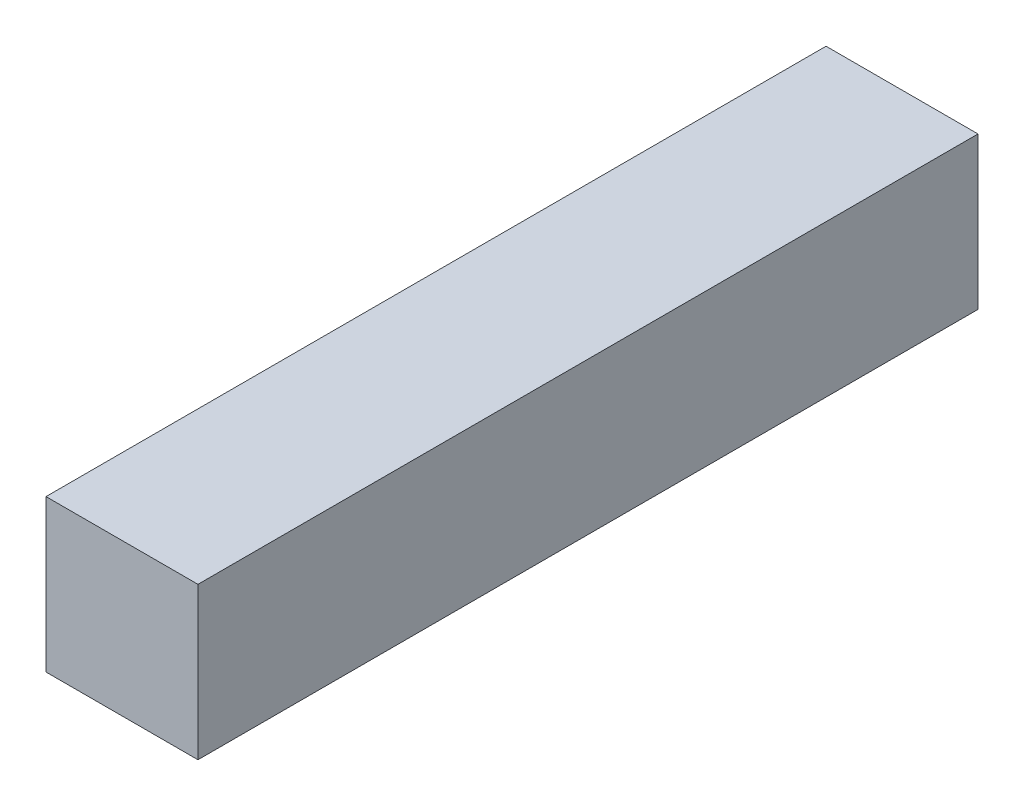
ISO-10303-21;
HEADER;
FILE_DESCRIPTION(('STEP AP214'),'2;1');
FILE_NAME('part.step','',(''),(''),'','','');
FILE_SCHEMA(('AUTOMOTIVE_DESIGN { 1 0 10303 214 1 1 1 1 }'));
ENDSEC;
DATA;
#1=APPLICATION_CONTEXT('core data for automotive mechanical design processes');
#2=APPLICATION_PROTOCOL_DEFINITION('international standard','automotive_design',2000,#1);
#3=PRODUCT_CONTEXT('',#1,'mechanical');
#4=PRODUCT('Part','Part','',(#3));
#5=PRODUCT_RELATED_PRODUCT_CATEGORY('part','',(#4));
#6=PRODUCT_DEFINITION_FORMATION('','',#4);
#7=PRODUCT_DEFINITION_CONTEXT('part definition',#1,'design');
#8=PRODUCT_DEFINITION('design','',#6,#7);
#9=PRODUCT_DEFINITION_SHAPE('','',#8);
#10=(LENGTH_UNIT() NAMED_UNIT(*) SI_UNIT(.MILLI.,.METRE.));
#11=(NAMED_UNIT(*) PLANE_ANGLE_UNIT() SI_UNIT($,.RADIAN.));
#12=(NAMED_UNIT(*) SI_UNIT($,.STERADIAN.) SOLID_ANGLE_UNIT());
#13=UNCERTAINTY_MEASURE_WITH_UNIT(LENGTH_MEASURE(1.E-05),#10,'distance_accuracy_value','');
#14=(GEOMETRIC_REPRESENTATION_CONTEXT(3) GLOBAL_UNCERTAINTY_ASSIGNED_CONTEXT((#13)) GLOBAL_UNIT_ASSIGNED_CONTEXT((#10,
#11,#12)) REPRESENTATION_CONTEXT('',''));
#15=CARTESIAN_POINT('',(0.,0.,0.));
#16=DIRECTION('',(0.,0.,1.));
#17=DIRECTION('',(1.,0.,0.));
#18=AXIS2_PLACEMENT_3D('',#15,#16,#17);
#19=CARTESIAN_POINT('',(7.5,7.5,77.));
#20=DIRECTION('',(-1.,0.,0.));
#21=DIRECTION('',(0.,-1.,0.));
#22=AXIS2_PLACEMENT_3D('',#19,#20,#21);
#23=PLANE('',#22);
#24=DIRECTION('',(0.,1.,0.));
#25=VECTOR('',#24,1.);
#26=CARTESIAN_POINT('',(7.5,7.5,0.));
#27=LINE('',#26,#25);
#28=CARTESIAN_POINT('',(7.5,-7.5,0.));
#29=VERTEX_POINT('',#28);
#30=CARTESIAN_POINT('',(7.5,7.5,0.));
#31=VERTEX_POINT('',#30);
#32=EDGE_CURVE('E101',#29,#31,#27,.T.);
#33=ORIENTED_EDGE('',*,*,#32,.T.);
#34=DIRECTION('',(0.,0.,-1.));
#35=VECTOR('',#34,1.);
#36=CARTESIAN_POINT('',(7.5,7.5,77.));
#37=LINE('',#36,#35);
#38=CARTESIAN_POINT('',(7.5,7.5,77.));
#39=VERTEX_POINT('',#38);
#40=EDGE_CURVE('E11',#39,#31,#37,.T.);
#41=ORIENTED_EDGE('',*,*,#40,.F.);
#42=DIRECTION('',(0.,1.,0.));
#43=VECTOR('',#42,1.);
#44=CARTESIAN_POINT('',(7.5,7.5,77.));
#45=LINE('',#44,#43);
#46=CARTESIAN_POINT('',(7.5,-7.5,77.));
#47=VERTEX_POINT('',#46);
#48=EDGE_CURVE('E89',#47,#39,#45,.T.);
#49=ORIENTED_EDGE('',*,*,#48,.F.);
#50=DIRECTION('',(0.,0.,-1.));
#51=VECTOR('',#50,1.);
#52=CARTESIAN_POINT('',(7.5,-7.5,77.));
#53=LINE('',#52,#51);
#54=EDGE_CURVE('E97',#47,#29,#53,.T.);
#55=ORIENTED_EDGE('',*,*,#54,.T.);
#56=EDGE_LOOP('',(#33,#41,#49,#55));
#57=FACE_BOUND('',#56,.T.);
#58=ADVANCED_FACE('F38',(#57),#23,.F.);
#59=CARTESIAN_POINT('',(-7.5,7.5,77.));
#60=DIRECTION('',(0.,-1.,0.));
#61=DIRECTION('',(0.,0.,-1.));
#62=AXIS2_PLACEMENT_3D('',#59,#60,#61);
#63=PLANE('',#62);
#64=DIRECTION('',(-1.,0.,0.));
#65=VECTOR('',#64,1.);
#66=CARTESIAN_POINT('',(-7.5,7.5,0.));
#67=LINE('',#66,#65);
#68=CARTESIAN_POINT('',(-7.5,7.5,0.));
#69=VERTEX_POINT('',#68);
#70=EDGE_CURVE('E93',#31,#69,#67,.T.);
#71=ORIENTED_EDGE('',*,*,#70,.T.);
#72=DIRECTION('',(0.,0.,-1.));
#73=VECTOR('',#72,1.);
#74=CARTESIAN_POINT('',(-7.5,7.5,77.));
#75=LINE('',#74,#73);
#76=CARTESIAN_POINT('',(-7.5,7.5,77.));
#77=VERTEX_POINT('',#76);
#78=EDGE_CURVE('E46',#77,#69,#75,.T.);
#79=ORIENTED_EDGE('',*,*,#78,.F.);
#80=DIRECTION('',(-1.,0.,0.));
#81=VECTOR('',#80,1.);
#82=CARTESIAN_POINT('',(-7.5,7.5,77.));
#83=LINE('',#82,#81);
#84=EDGE_CURVE('E84',#39,#77,#83,.T.);
#85=ORIENTED_EDGE('',*,*,#84,.F.);
#86=ORIENTED_EDGE('',*,*,#40,.T.);
#87=EDGE_LOOP('',(#71,#79,#85,#86));
#88=FACE_BOUND('',#87,.T.);
#89=ADVANCED_FACE('F92',(#88),#63,.F.);
#90=CARTESIAN_POINT('',(-7.5,7.5,77.));
#91=DIRECTION('',(1.,0.,0.));
#92=DIRECTION('',(0.,1.,0.));
#93=AXIS2_PLACEMENT_3D('',#90,#91,#92);
#94=PLANE('',#93);
#95=DIRECTION('',(0.,-1.,0.));
#96=VECTOR('',#95,1.);
#97=CARTESIAN_POINT('',(-7.5,7.5,0.));
#98=LINE('',#97,#96);
#99=CARTESIAN_POINT('',(-7.5,-7.5,0.));
#100=VERTEX_POINT('',#99);
#101=EDGE_CURVE('E71',#69,#100,#98,.T.);
#102=ORIENTED_EDGE('',*,*,#101,.T.);
#103=DIRECTION('',(0.,0.,-1.));
#104=VECTOR('',#103,1.);
#105=CARTESIAN_POINT('',(-7.5,-7.5,77.));
#106=LINE('',#105,#104);
#107=CARTESIAN_POINT('',(-7.5,-7.5,77.));
#108=VERTEX_POINT('',#107);
#109=EDGE_CURVE('E94',#108,#100,#106,.T.);
#110=ORIENTED_EDGE('',*,*,#109,.F.);
#111=DIRECTION('',(0.,-1.,0.));
#112=VECTOR('',#111,1.);
#113=CARTESIAN_POINT('',(-7.5,7.5,77.));
#114=LINE('',#113,#112);
#115=EDGE_CURVE('E87',#77,#108,#114,.T.);
#116=ORIENTED_EDGE('',*,*,#115,.F.);
#117=ORIENTED_EDGE('',*,*,#78,.T.);
#118=EDGE_LOOP('',(#102,#110,#116,#117));
#119=FACE_BOUND('',#118,.T.);
#120=ADVANCED_FACE('F95',(#119),#94,.F.);
#121=CARTESIAN_POINT('',(-7.5,-7.5,77.));
#122=DIRECTION('',(0.,1.,0.));
#123=DIRECTION('',(0.,0.,1.));
#124=AXIS2_PLACEMENT_3D('',#121,#122,#123);
#125=PLANE('',#124);
#126=DIRECTION('',(1.,0.,0.));
#127=VECTOR('',#126,1.);
#128=CARTESIAN_POINT('',(-7.5,-7.5,0.));
#129=LINE('',#128,#127);
#130=EDGE_CURVE('E77',#100,#29,#129,.T.);
#131=ORIENTED_EDGE('',*,*,#130,.T.);
#132=ORIENTED_EDGE('',*,*,#54,.F.);
#133=DIRECTION('',(1.,0.,0.));
#134=VECTOR('',#133,1.);
#135=CARTESIAN_POINT('',(-7.5,-7.5,77.));
#136=LINE('',#135,#134);
#137=EDGE_CURVE('E54',#108,#47,#136,.T.);
#138=ORIENTED_EDGE('',*,*,#137,.F.);
#139=ORIENTED_EDGE('',*,*,#109,.T.);
#140=EDGE_LOOP('',(#131,#132,#138,#139));
#141=FACE_BOUND('',#140,.T.);
#142=ADVANCED_FACE('F108',(#141),#125,.F.);
#143=CARTESIAN_POINT('',(0.,0.,77.));
#144=DIRECTION('',(0.,0.,1.));
#145=DIRECTION('',(1.,0.,0.));
#146=AXIS2_PLACEMENT_3D('',#143,#144,#145);
#147=PLANE('',#146);
#148=ORIENTED_EDGE('',*,*,#48,.T.);
#149=ORIENTED_EDGE('',*,*,#84,.T.);
#150=ORIENTED_EDGE('',*,*,#115,.T.);
#151=ORIENTED_EDGE('',*,*,#137,.T.);
#152=EDGE_LOOP('',(#148,#149,#150,#151));
#153=FACE_BOUND('',#152,.T.);
#154=ADVANCED_FACE('F85',(#153),#147,.T.);
#155=CARTESIAN_POINT('',(0.,0.,0.));
#156=DIRECTION('',(0.,0.,1.));
#157=DIRECTION('',(1.,0.,0.));
#158=AXIS2_PLACEMENT_3D('',#155,#156,#157);
#159=PLANE('',#158);
#160=ORIENTED_EDGE('',*,*,#32,.F.);
#161=ORIENTED_EDGE('',*,*,#130,.F.);
#162=ORIENTED_EDGE('',*,*,#101,.F.);
#163=ORIENTED_EDGE('',*,*,#70,.F.);
#164=EDGE_LOOP('',(#160,#161,#162,#163));
#165=FACE_BOUND('',#164,.T.);
#166=ADVANCED_FACE('F111',(#165),#159,.F.);
#167=CLOSED_SHELL('',(#58,#89,#120,#142,#154,#166));
#168=MANIFOLD_SOLID_BREP('B2',#167);
#169=ADVANCED_BREP_SHAPE_REPRESENTATION('',(#18,#168),#14);
#170=SHAPE_DEFINITION_REPRESENTATION(#9,#169);
ENDSEC;
END-ISO-10303-21;
